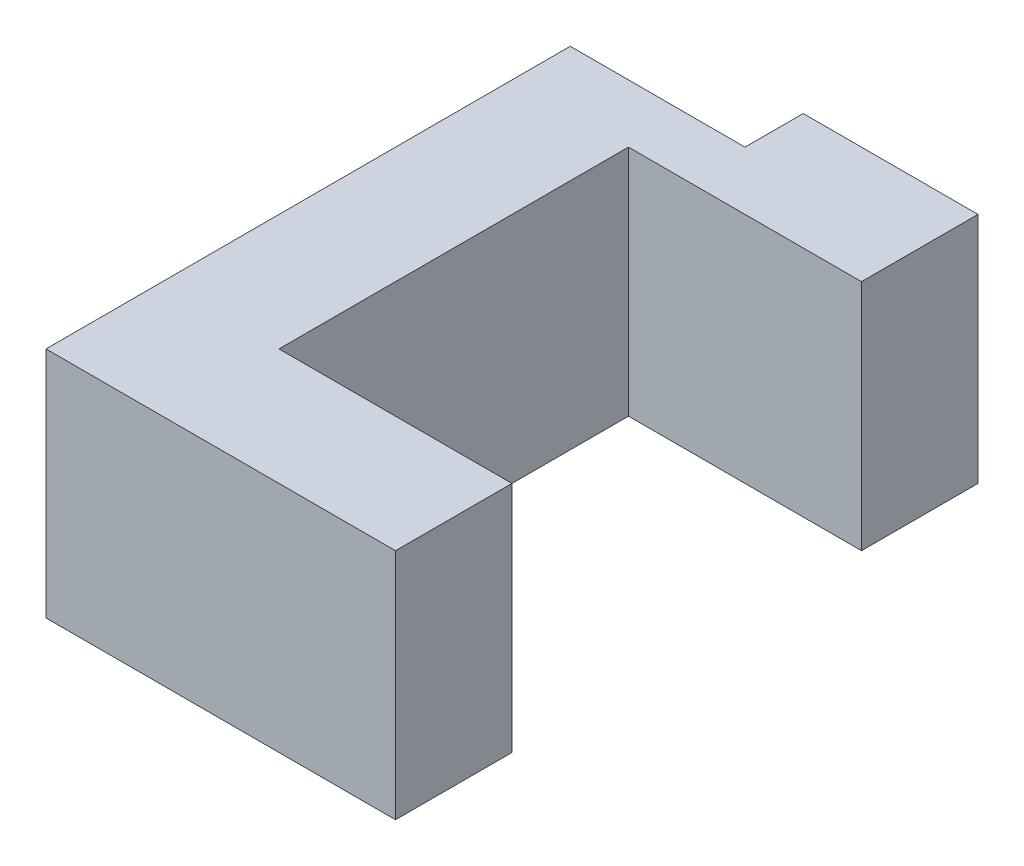
ISO-10303-21;
HEADER;
FILE_DESCRIPTION(('STEP AP214'),'2;1');
FILE_NAME('part.step','',(''),(''),'','','');
FILE_SCHEMA(('AUTOMOTIVE_DESIGN { 1 0 10303 214 1 1 1 1 }'));
ENDSEC;
DATA;
#1=APPLICATION_CONTEXT('core data for automotive mechanical design processes');
#2=APPLICATION_PROTOCOL_DEFINITION('international standard','automotive_design',2000,#1);
#3=PRODUCT_CONTEXT('',#1,'mechanical');
#4=PRODUCT('Part','Part','',(#3));
#5=PRODUCT_RELATED_PRODUCT_CATEGORY('part','',(#4));
#6=PRODUCT_DEFINITION_FORMATION('','',#4);
#7=PRODUCT_DEFINITION_CONTEXT('part definition',#1,'design');
#8=PRODUCT_DEFINITION('design','',#6,#7);
#9=PRODUCT_DEFINITION_SHAPE('','',#8);
#10=(LENGTH_UNIT() NAMED_UNIT(*) SI_UNIT(.MILLI.,.METRE.));
#11=(NAMED_UNIT(*) PLANE_ANGLE_UNIT() SI_UNIT($,.RADIAN.));
#12=(NAMED_UNIT(*) SI_UNIT($,.STERADIAN.) SOLID_ANGLE_UNIT());
#13=UNCERTAINTY_MEASURE_WITH_UNIT(LENGTH_MEASURE(1.E-05),#10,'distance_accuracy_value','');
#14=(GEOMETRIC_REPRESENTATION_CONTEXT(3) GLOBAL_UNCERTAINTY_ASSIGNED_CONTEXT((#13)) GLOBAL_UNIT_ASSIGNED_CONTEXT((#10,
#11,#12)) REPRESENTATION_CONTEXT('',''));
#15=CARTESIAN_POINT('',(0.,0.,0.));
#16=DIRECTION('',(0.,0.,1.));
#17=DIRECTION('',(1.,0.,0.));
#18=AXIS2_PLACEMENT_3D('',#15,#16,#17);
#19=CARTESIAN_POINT('',(30.,20.,0.));
#20=DIRECTION('',(0.,0.,1.));
#21=DIRECTION('',(1.,0.,0.));
#22=AXIS2_PLACEMENT_3D('',#19,#20,#21);
#23=PLANE('',#22);
#24=DIRECTION('',(-1.,0.,0.));
#25=VECTOR('',#24,1.);
#26=CARTESIAN_POINT('',(0.,2.,0.));
#27=LINE('',#26,#25);
#28=CARTESIAN_POINT('',(15.0006186998439,2.,0.));
#29=VERTEX_POINT('',#28);
#30=CARTESIAN_POINT('',(0.,2.,0.));
#31=VERTEX_POINT('',#30);
#32=EDGE_CURVE('E222',#29,#31,#27,.T.);
#33=ORIENTED_EDGE('',*,*,#32,.F.);
#34=DIRECTION('',(0.,1.,0.));
#35=VECTOR('',#34,1.);
#36=CARTESIAN_POINT('',(15.0006186998439,2.,0.));
#37=LINE('',#36,#35);
#38=CARTESIAN_POINT('',(15.0006186998439,20.,0.));
#39=VERTEX_POINT('',#38);
#40=EDGE_CURVE('E154',#29,#39,#37,.T.);
#41=ORIENTED_EDGE('',*,*,#40,.T.);
#42=DIRECTION('',(-1.,0.,0.));
#43=VECTOR('',#42,1.);
#44=CARTESIAN_POINT('',(30.,20.,0.));
#45=LINE('',#44,#43);
#46=CARTESIAN_POINT('',(30.,20.,0.));
#47=VERTEX_POINT('',#46);
#48=EDGE_CURVE('E173',#47,#39,#45,.T.);
#49=ORIENTED_EDGE('',*,*,#48,.F.);
#50=DIRECTION('',(0.,-1.,0.));
#51=VECTOR('',#50,1.);
#52=CARTESIAN_POINT('',(30.,20.,0.));
#53=LINE('',#52,#51);
#54=CARTESIAN_POINT('',(30.,0.,0.));
#55=VERTEX_POINT('',#54);
#56=EDGE_CURVE('E145',#47,#55,#53,.T.);
#57=ORIENTED_EDGE('',*,*,#56,.T.);
#58=DIRECTION('',(-1.,0.,0.));
#59=VECTOR('',#58,1.);
#60=CARTESIAN_POINT('',(30.,0.,0.));
#61=LINE('',#60,#59);
#62=CARTESIAN_POINT('',(0.,0.,0.));
#63=VERTEX_POINT('',#62);
#64=EDGE_CURVE('E149',#55,#63,#61,.T.);
#65=ORIENTED_EDGE('',*,*,#64,.T.);
#66=DIRECTION('',(0.,-1.,0.));
#67=VECTOR('',#66,1.);
#68=CARTESIAN_POINT('',(0.,20.,0.));
#69=LINE('',#68,#67);
#70=EDGE_CURVE('E11',#31,#63,#69,.T.);
#71=ORIENTED_EDGE('',*,*,#70,.F.);
#72=EDGE_LOOP('',(#33,#41,#49,#57,#65,#71));
#73=FACE_BOUND('',#72,.T.);
#74=ADVANCED_FACE('F39',(#73),#23,.F.);
#75=CARTESIAN_POINT('',(0.,20.,0.));
#76=DIRECTION('',(1.,0.,0.));
#77=DIRECTION('',(0.,0.,-1.));
#78=AXIS2_PLACEMENT_3D('',#75,#76,#77);
#79=PLANE('',#78);
#80=DIRECTION('',(0.,0.,1.));
#81=VECTOR('',#80,1.);
#82=CARTESIAN_POINT('',(0.,20.,0.));
#83=LINE('',#82,#81);
#84=CARTESIAN_POINT('',(0.,20.,5.));
#85=VERTEX_POINT('',#84);
#86=CARTESIAN_POINT('',(0.,20.,50.));
#87=VERTEX_POINT('',#86);
#88=EDGE_CURVE('E102',#85,#87,#83,.T.);
#89=ORIENTED_EDGE('',*,*,#88,.F.);
#90=DIRECTION('',(0.,1.,0.));
#91=VECTOR('',#90,1.);
#92=CARTESIAN_POINT('',(0.,2.,5.));
#93=LINE('',#92,#91);
#94=CARTESIAN_POINT('',(0.,2.,5.));
#95=VERTEX_POINT('',#94);
#96=EDGE_CURVE('E54',#95,#85,#93,.T.);
#97=ORIENTED_EDGE('',*,*,#96,.F.);
#98=DIRECTION('',(0.,0.,1.));
#99=VECTOR('',#98,1.);
#100=CARTESIAN_POINT('',(0.,2.,0.));
#101=LINE('',#100,#99);
#102=EDGE_CURVE('E233',#31,#95,#101,.T.);
#103=ORIENTED_EDGE('',*,*,#102,.F.);
#104=ORIENTED_EDGE('',*,*,#70,.T.);
#105=DIRECTION('',(0.,0.,1.));
#106=VECTOR('',#105,1.);
#107=CARTESIAN_POINT('',(0.,0.,0.));
#108=LINE('',#107,#106);
#109=CARTESIAN_POINT('',(0.,0.,50.));
#110=VERTEX_POINT('',#109);
#111=EDGE_CURVE('E153',#63,#110,#108,.T.);
#112=ORIENTED_EDGE('',*,*,#111,.T.);
#113=DIRECTION('',(0.,-1.,0.));
#114=VECTOR('',#113,1.);
#115=CARTESIAN_POINT('',(0.,20.,50.));
#116=LINE('',#115,#114);
#117=EDGE_CURVE('E47',#87,#110,#116,.T.);
#118=ORIENTED_EDGE('',*,*,#117,.F.);
#119=EDGE_LOOP('',(#89,#97,#103,#104,#112,#118));
#120=FACE_BOUND('',#119,.T.);
#121=ADVANCED_FACE('F258',(#120),#79,.F.);
#122=CARTESIAN_POINT('',(0.,20.,50.));
#123=DIRECTION('',(0.,0.,-1.));
#124=DIRECTION('',(-1.,0.,0.));
#125=AXIS2_PLACEMENT_3D('',#122,#123,#124);
#126=PLANE('',#125);
#127=DIRECTION('',(1.,0.,0.));
#128=VECTOR('',#127,1.);
#129=CARTESIAN_POINT('',(0.,0.,50.));
#130=LINE('',#129,#128);
#131=CARTESIAN_POINT('',(30.,0.,50.));
#132=VERTEX_POINT('',#131);
#133=EDGE_CURVE('E157',#110,#132,#130,.T.);
#134=ORIENTED_EDGE('',*,*,#133,.T.);
#135=DIRECTION('',(0.,-1.,0.));
#136=VECTOR('',#135,1.);
#137=CARTESIAN_POINT('',(30.,20.,50.));
#138=LINE('',#137,#136);
#139=CARTESIAN_POINT('',(30.,20.,50.));
#140=VERTEX_POINT('',#139);
#141=EDGE_CURVE('E184',#140,#132,#138,.T.);
#142=ORIENTED_EDGE('',*,*,#141,.F.);
#143=DIRECTION('',(1.,0.,0.));
#144=VECTOR('',#143,1.);
#145=CARTESIAN_POINT('',(0.,20.,50.));
#146=LINE('',#145,#144);
#147=EDGE_CURVE('E194',#87,#140,#146,.T.);
#148=ORIENTED_EDGE('',*,*,#147,.F.);
#149=ORIENTED_EDGE('',*,*,#117,.T.);
#150=EDGE_LOOP('',(#134,#142,#148,#149));
#151=FACE_BOUND('',#150,.T.);
#152=ADVANCED_FACE('F192',(#151),#126,.F.);
#153=CARTESIAN_POINT('',(30.,20.,50.));
#154=DIRECTION('',(-1.,0.,0.));
#155=DIRECTION('',(0.,0.,1.));
#156=AXIS2_PLACEMENT_3D('',#153,#154,#155);
#157=PLANE('',#156);
#158=DIRECTION('',(0.,0.,-1.));
#159=VECTOR('',#158,1.);
#160=CARTESIAN_POINT('',(30.,0.,50.));
#161=LINE('',#160,#159);
#162=CARTESIAN_POINT('',(30.,0.,40.));
#163=VERTEX_POINT('',#162);
#164=EDGE_CURVE('E160',#132,#163,#161,.T.);
#165=ORIENTED_EDGE('',*,*,#164,.T.);
#166=DIRECTION('',(0.,-1.,0.));
#167=VECTOR('',#166,1.);
#168=CARTESIAN_POINT('',(30.,20.,40.));
#169=LINE('',#168,#167);
#170=CARTESIAN_POINT('',(30.,20.,40.));
#171=VERTEX_POINT('',#170);
#172=EDGE_CURVE('E180',#171,#163,#169,.T.);
#173=ORIENTED_EDGE('',*,*,#172,.F.);
#174=DIRECTION('',(0.,0.,-1.));
#175=VECTOR('',#174,1.);
#176=CARTESIAN_POINT('',(30.,20.,50.));
#177=LINE('',#176,#175);
#178=EDGE_CURVE('E209',#140,#171,#177,.T.);
#179=ORIENTED_EDGE('',*,*,#178,.F.);
#180=ORIENTED_EDGE('',*,*,#141,.T.);
#181=EDGE_LOOP('',(#165,#173,#179,#180));
#182=FACE_BOUND('',#181,.T.);
#183=ADVANCED_FACE('F204',(#182),#157,.F.);
#184=CARTESIAN_POINT('',(30.,20.,40.));
#185=DIRECTION('',(0.,0.,1.));
#186=DIRECTION('',(1.,0.,0.));
#187=AXIS2_PLACEMENT_3D('',#184,#185,#186);
#188=PLANE('',#187);
#189=DIRECTION('',(-1.,0.,0.));
#190=VECTOR('',#189,1.);
#191=CARTESIAN_POINT('',(30.,0.,40.));
#192=LINE('',#191,#190);
#193=CARTESIAN_POINT('',(10.,0.,40.));
#194=VERTEX_POINT('',#193);
#195=EDGE_CURVE('E163',#163,#194,#192,.T.);
#196=ORIENTED_EDGE('',*,*,#195,.T.);
#197=DIRECTION('',(0.,-1.,0.));
#198=VECTOR('',#197,1.);
#199=CARTESIAN_POINT('',(10.,20.,40.));
#200=LINE('',#199,#198);
#201=CARTESIAN_POINT('',(10.,20.,40.));
#202=VERTEX_POINT('',#201);
#203=EDGE_CURVE('E138',#202,#194,#200,.T.);
#204=ORIENTED_EDGE('',*,*,#203,.F.);
#205=DIRECTION('',(-1.,0.,0.));
#206=VECTOR('',#205,1.);
#207=CARTESIAN_POINT('',(30.,20.,40.));
#208=LINE('',#207,#206);
#209=EDGE_CURVE('E124',#171,#202,#208,.T.);
#210=ORIENTED_EDGE('',*,*,#209,.F.);
#211=ORIENTED_EDGE('',*,*,#172,.T.);
#212=EDGE_LOOP('',(#196,#204,#210,#211));
#213=FACE_BOUND('',#212,.T.);
#214=ADVANCED_FACE('F207',(#213),#188,.F.);
#215=CARTESIAN_POINT('',(10.,20.,40.));
#216=DIRECTION('',(-1.,0.,0.));
#217=DIRECTION('',(0.,0.,1.));
#218=AXIS2_PLACEMENT_3D('',#215,#216,#217);
#219=PLANE('',#218);
#220=DIRECTION('',(0.,0.,-1.));
#221=VECTOR('',#220,1.);
#222=CARTESIAN_POINT('',(10.,0.,40.));
#223=LINE('',#222,#221);
#224=CARTESIAN_POINT('',(10.,0.,10.));
#225=VERTEX_POINT('',#224);
#226=EDGE_CURVE('E134',#194,#225,#223,.T.);
#227=ORIENTED_EDGE('',*,*,#226,.T.);
#228=DIRECTION('',(0.,-1.,0.));
#229=VECTOR('',#228,1.);
#230=CARTESIAN_POINT('',(10.,20.,10.));
#231=LINE('',#230,#229);
#232=CARTESIAN_POINT('',(10.,20.,10.));
#233=VERTEX_POINT('',#232);
#234=EDGE_CURVE('E131',#233,#225,#231,.T.);
#235=ORIENTED_EDGE('',*,*,#234,.F.);
#236=DIRECTION('',(0.,0.,-1.));
#237=VECTOR('',#236,1.);
#238=CARTESIAN_POINT('',(10.,20.,40.));
#239=LINE('',#238,#237);
#240=EDGE_CURVE('E116',#202,#233,#239,.T.);
#241=ORIENTED_EDGE('',*,*,#240,.F.);
#242=ORIENTED_EDGE('',*,*,#203,.T.);
#243=EDGE_LOOP('',(#227,#235,#241,#242));
#244=FACE_BOUND('',#243,.T.);
#245=ADVANCED_FACE('F132',(#244),#219,.F.);
#246=CARTESIAN_POINT('',(10.,20.,10.));
#247=DIRECTION('',(0.,0.,-1.));
#248=DIRECTION('',(-1.,0.,0.));
#249=AXIS2_PLACEMENT_3D('',#246,#247,#248);
#250=PLANE('',#249);
#251=DIRECTION('',(1.,0.,0.));
#252=VECTOR('',#251,1.);
#253=CARTESIAN_POINT('',(10.,0.,10.));
#254=LINE('',#253,#252);
#255=CARTESIAN_POINT('',(30.,0.,10.));
#256=VERTEX_POINT('',#255);
#257=EDGE_CURVE('E168',#225,#256,#254,.T.);
#258=ORIENTED_EDGE('',*,*,#257,.T.);
#259=DIRECTION('',(0.,-1.,0.));
#260=VECTOR('',#259,1.);
#261=CARTESIAN_POINT('',(30.,20.,10.));
#262=LINE('',#261,#260);
#263=CARTESIAN_POINT('',(30.,20.,10.));
#264=VERTEX_POINT('',#263);
#265=EDGE_CURVE('E139',#264,#256,#262,.T.);
#266=ORIENTED_EDGE('',*,*,#265,.F.);
#267=DIRECTION('',(1.,0.,0.));
#268=VECTOR('',#267,1.);
#269=CARTESIAN_POINT('',(10.,20.,10.));
#270=LINE('',#269,#268);
#271=EDGE_CURVE('E121',#233,#264,#270,.T.);
#272=ORIENTED_EDGE('',*,*,#271,.F.);
#273=ORIENTED_EDGE('',*,*,#234,.T.);
#274=EDGE_LOOP('',(#258,#266,#272,#273));
#275=FACE_BOUND('',#274,.T.);
#276=ADVANCED_FACE('F141',(#275),#250,.F.);
#277=CARTESIAN_POINT('',(30.,20.,10.));
#278=DIRECTION('',(-1.,0.,0.));
#279=DIRECTION('',(0.,0.,1.));
#280=AXIS2_PLACEMENT_3D('',#277,#278,#279);
#281=PLANE('',#280);
#282=DIRECTION('',(0.,0.,-1.));
#283=VECTOR('',#282,1.);
#284=CARTESIAN_POINT('',(30.,0.,10.));
#285=LINE('',#284,#283);
#286=EDGE_CURVE('E95',#256,#55,#285,.T.);
#287=ORIENTED_EDGE('',*,*,#286,.T.);
#288=ORIENTED_EDGE('',*,*,#56,.F.);
#289=DIRECTION('',(0.,0.,-1.));
#290=VECTOR('',#289,1.);
#291=CARTESIAN_POINT('',(30.,20.,10.));
#292=LINE('',#291,#290);
#293=EDGE_CURVE('E63',#264,#47,#292,.T.);
#294=ORIENTED_EDGE('',*,*,#293,.F.);
#295=ORIENTED_EDGE('',*,*,#265,.T.);
#296=EDGE_LOOP('',(#287,#288,#294,#295));
#297=FACE_BOUND('',#296,.T.);
#298=ADVANCED_FACE('F275',(#297),#281,.F.);
#299=CARTESIAN_POINT('',(0.,20.,0.));
#300=DIRECTION('',(0.,1.,0.));
#301=DIRECTION('',(0.,0.,1.));
#302=AXIS2_PLACEMENT_3D('',#299,#300,#301);
#303=PLANE('',#302);
#304=DIRECTION('',(0.,0.,-1.));
#305=VECTOR('',#304,1.);
#306=CARTESIAN_POINT('',(15.0006186998439,20.,0.));
#307=LINE('',#306,#305);
#308=CARTESIAN_POINT('',(15.0006186998439,20.,5.));
#309=VERTEX_POINT('',#308);
#310=EDGE_CURVE('E229',#309,#39,#307,.T.);
#311=ORIENTED_EDGE('',*,*,#310,.F.);
#312=DIRECTION('',(1.,0.,0.));
#313=VECTOR('',#312,1.);
#314=CARTESIAN_POINT('',(0.,20.,5.));
#315=LINE('',#314,#313);
#316=EDGE_CURVE('E234',#85,#309,#315,.T.);
#317=ORIENTED_EDGE('',*,*,#316,.F.);
#318=ORIENTED_EDGE('',*,*,#88,.T.);
#319=ORIENTED_EDGE('',*,*,#147,.T.);
#320=ORIENTED_EDGE('',*,*,#178,.T.);
#321=ORIENTED_EDGE('',*,*,#209,.T.);
#322=ORIENTED_EDGE('',*,*,#240,.T.);
#323=ORIENTED_EDGE('',*,*,#271,.T.);
#324=ORIENTED_EDGE('',*,*,#293,.T.);
#325=ORIENTED_EDGE('',*,*,#48,.T.);
#326=EDGE_LOOP('',(#311,#317,#318,#319,#320,#321,#322,#323,#324,#325));
#327=FACE_BOUND('',#326,.T.);
#328=ADVANCED_FACE('F119',(#327),#303,.T.);
#329=CARTESIAN_POINT('',(0.,0.,0.));
#330=DIRECTION('',(0.,1.,0.));
#331=DIRECTION('',(0.,0.,1.));
#332=AXIS2_PLACEMENT_3D('',#329,#330,#331);
#333=PLANE('',#332);
#334=ORIENTED_EDGE('',*,*,#64,.F.);
#335=ORIENTED_EDGE('',*,*,#286,.F.);
#336=ORIENTED_EDGE('',*,*,#257,.F.);
#337=ORIENTED_EDGE('',*,*,#226,.F.);
#338=ORIENTED_EDGE('',*,*,#195,.F.);
#339=ORIENTED_EDGE('',*,*,#164,.F.);
#340=ORIENTED_EDGE('',*,*,#133,.F.);
#341=ORIENTED_EDGE('',*,*,#111,.F.);
#342=EDGE_LOOP('',(#334,#335,#336,#337,#338,#339,#340,#341));
#343=FACE_BOUND('',#342,.T.);
#344=ADVANCED_FACE('F200',(#343),#333,.F.);
#345=CARTESIAN_POINT('',(15.0006186998439,2.,0.));
#346=DIRECTION('',(1.,0.,0.));
#347=DIRECTION('',(0.,0.,-1.));
#348=AXIS2_PLACEMENT_3D('',#345,#346,#347);
#349=PLANE('',#348);
#350=ORIENTED_EDGE('',*,*,#310,.T.);
#351=ORIENTED_EDGE('',*,*,#40,.F.);
#352=DIRECTION('',(0.,0.,-1.));
#353=VECTOR('',#352,1.);
#354=CARTESIAN_POINT('',(15.0006186998439,2.,0.));
#355=LINE('',#354,#353);
#356=CARTESIAN_POINT('',(15.0006186998439,2.,5.));
#357=VERTEX_POINT('',#356);
#358=EDGE_CURVE('E240',#357,#29,#355,.T.);
#359=ORIENTED_EDGE('',*,*,#358,.F.);
#360=DIRECTION('',(0.,1.,0.));
#361=VECTOR('',#360,1.);
#362=CARTESIAN_POINT('',(15.0006186998439,2.,5.));
#363=LINE('',#362,#361);
#364=EDGE_CURVE('E221',#357,#309,#363,.T.);
#365=ORIENTED_EDGE('',*,*,#364,.T.);
#366=EDGE_LOOP('',(#350,#351,#359,#365));
#367=FACE_BOUND('',#366,.T.);
#368=ADVANCED_FACE('F280',(#367),#349,.F.);
#369=CARTESIAN_POINT('',(0.,2.,5.));
#370=DIRECTION('',(0.,0.,1.));
#371=DIRECTION('',(1.,0.,0.));
#372=AXIS2_PLACEMENT_3D('',#369,#370,#371);
#373=PLANE('',#372);
#374=ORIENTED_EDGE('',*,*,#316,.T.);
#375=ORIENTED_EDGE('',*,*,#364,.F.);
#376=DIRECTION('',(1.,0.,0.));
#377=VECTOR('',#376,1.);
#378=CARTESIAN_POINT('',(0.,2.,5.));
#379=LINE('',#378,#377);
#380=EDGE_CURVE('E244',#95,#357,#379,.T.);
#381=ORIENTED_EDGE('',*,*,#380,.F.);
#382=ORIENTED_EDGE('',*,*,#96,.T.);
#383=EDGE_LOOP('',(#374,#375,#381,#382));
#384=FACE_BOUND('',#383,.T.);
#385=ADVANCED_FACE('F283',(#384),#373,.F.);
#386=CARTESIAN_POINT('',(0.,2.,0.));
#387=DIRECTION('',(0.,1.,0.));
#388=DIRECTION('',(0.,0.,1.));
#389=AXIS2_PLACEMENT_3D('',#386,#387,#388);
#390=PLANE('',#389);
#391=ORIENTED_EDGE('',*,*,#102,.T.);
#392=ORIENTED_EDGE('',*,*,#380,.T.);
#393=ORIENTED_EDGE('',*,*,#358,.T.);
#394=ORIENTED_EDGE('',*,*,#32,.T.);
#395=EDGE_LOOP('',(#391,#392,#393,#394));
#396=FACE_BOUND('',#395,.T.);
#397=ADVANCED_FACE('F253',(#396),#390,.T.);
#398=CLOSED_SHELL('',(#74,#121,#152,#183,#214,#245,#276,#298,#328,#344,#368,#385,#397));
#399=MANIFOLD_SOLID_BREP('B2',#398);
#400=ADVANCED_BREP_SHAPE_REPRESENTATION('',(#18,#399),#14);
#401=SHAPE_DEFINITION_REPRESENTATION(#9,#400);
ENDSEC;
END-ISO-10303-21;
